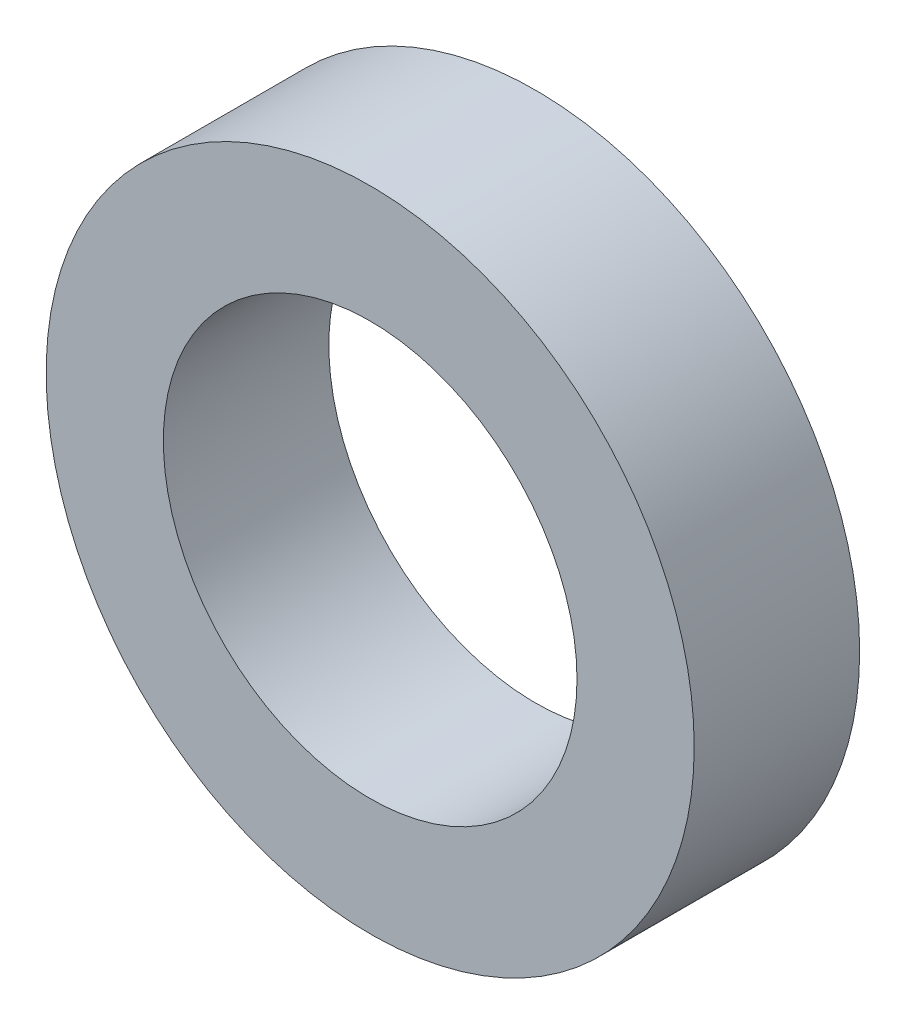
ISO-10303-21;
HEADER;
FILE_DESCRIPTION(('STEP AP214'),'2;1');
FILE_NAME('part.step','',(''),(''),'','','');
FILE_SCHEMA(('AUTOMOTIVE_DESIGN { 1 0 10303 214 1 1 1 1 }'));
ENDSEC;
DATA;
#1=APPLICATION_CONTEXT('core data for automotive mechanical design processes');
#2=APPLICATION_PROTOCOL_DEFINITION('international standard','automotive_design',2000,#1);
#3=PRODUCT_CONTEXT('',#1,'mechanical');
#4=PRODUCT('Part','Part','',(#3));
#5=PRODUCT_RELATED_PRODUCT_CATEGORY('part','',(#4));
#6=PRODUCT_DEFINITION_FORMATION('','',#4);
#7=PRODUCT_DEFINITION_CONTEXT('part definition',#1,'design');
#8=PRODUCT_DEFINITION('design','',#6,#7);
#9=PRODUCT_DEFINITION_SHAPE('','',#8);
#10=(LENGTH_UNIT() NAMED_UNIT(*) SI_UNIT(.MILLI.,.METRE.));
#11=(NAMED_UNIT(*) PLANE_ANGLE_UNIT() SI_UNIT($,.RADIAN.));
#12=(NAMED_UNIT(*) SI_UNIT($,.STERADIAN.) SOLID_ANGLE_UNIT());
#13=UNCERTAINTY_MEASURE_WITH_UNIT(LENGTH_MEASURE(1.E-05),#10,'distance_accuracy_value','');
#14=(GEOMETRIC_REPRESENTATION_CONTEXT(3) GLOBAL_UNCERTAINTY_ASSIGNED_CONTEXT((#13)) GLOBAL_UNIT_ASSIGNED_CONTEXT((#10,
#11,#12)) REPRESENTATION_CONTEXT('',''));
#15=CARTESIAN_POINT('',(0.,0.,0.));
#16=DIRECTION('',(0.,0.,1.));
#17=DIRECTION('',(1.,0.,0.));
#18=AXIS2_PLACEMENT_3D('',#15,#16,#17);
#19=CARTESIAN_POINT('',(0.,0.,12.));
#20=DIRECTION('',(0.,0.,1.));
#21=DIRECTION('',(1.,0.,0.));
#22=AXIS2_PLACEMENT_3D('',#19,#20,#21);
#23=PLANE('',#22);
#24=CARTESIAN_POINT('',(0.,0.,12.));
#25=DIRECTION('',(0.,0.,1.));
#26=DIRECTION('',(1.,0.,0.));
#27=AXIS2_PLACEMENT_3D('',#24,#25,#26);
#28=CIRCLE('',#27,23.5);
#29=CARTESIAN_POINT('',(23.5,0.,12.));
#30=VERTEX_POINT('',#29);
#31=EDGE_CURVE('E10',#30,#30,#28,.T.);
#32=ORIENTED_EDGE('',*,*,#31,.T.);
#33=EDGE_LOOP('',(#32));
#34=FACE_BOUND('',#33,.T.);
#35=CARTESIAN_POINT('',(0.,0.,12.));
#36=DIRECTION('',(0.,0.,1.));
#37=DIRECTION('',(1.,0.,0.));
#38=AXIS2_PLACEMENT_3D('',#35,#36,#37);
#39=CIRCLE('',#38,15.);
#40=CARTESIAN_POINT('',(15.,0.,12.));
#41=VERTEX_POINT('',#40);
#42=EDGE_CURVE('E43',#41,#41,#39,.T.);
#43=ORIENTED_EDGE('',*,*,#42,.F.);
#44=EDGE_LOOP('',(#43));
#45=FACE_BOUND('',#44,.T.);
#46=ADVANCED_FACE('F32',(#34,#45),#23,.T.);
#47=CARTESIAN_POINT('',(0.,0.,0.));
#48=DIRECTION('',(0.,0.,1.));
#49=DIRECTION('',(1.,0.,0.));
#50=AXIS2_PLACEMENT_3D('',#47,#48,#49);
#51=PLANE('',#50);
#52=CARTESIAN_POINT('',(0.,0.,0.));
#53=DIRECTION('',(0.,0.,1.));
#54=DIRECTION('',(1.,0.,0.));
#55=AXIS2_PLACEMENT_3D('',#52,#53,#54);
#56=CIRCLE('',#55,23.5);
#57=CARTESIAN_POINT('',(23.5,0.,0.));
#58=VERTEX_POINT('',#57);
#59=EDGE_CURVE('E36',#58,#58,#56,.T.);
#60=ORIENTED_EDGE('',*,*,#59,.F.);
#61=EDGE_LOOP('',(#60));
#62=FACE_BOUND('',#61,.T.);
#63=CARTESIAN_POINT('',(0.,0.,0.));
#64=DIRECTION('',(0.,0.,1.));
#65=DIRECTION('',(1.,0.,0.));
#66=AXIS2_PLACEMENT_3D('',#63,#64,#65);
#67=CIRCLE('',#66,15.);
#68=CARTESIAN_POINT('',(15.,0.,0.));
#69=VERTEX_POINT('',#68);
#70=EDGE_CURVE('E45',#69,#69,#67,.T.);
#71=ORIENTED_EDGE('',*,*,#70,.T.);
#72=EDGE_LOOP('',(#71));
#73=FACE_BOUND('',#72,.T.);
#74=ADVANCED_FACE('F55',(#62,#73),#51,.F.);
#75=CARTESIAN_POINT('',(0.,0.,12.));
#76=DIRECTION('',(0.,0.,-1.));
#77=DIRECTION('',(-1.,0.,0.));
#78=AXIS2_PLACEMENT_3D('',#75,#76,#77);
#79=CYLINDRICAL_SURFACE('',#78,23.5);
#80=ORIENTED_EDGE('',*,*,#31,.F.);
#81=EDGE_LOOP('',(#80));
#82=FACE_BOUND('',#81,.T.);
#83=ORIENTED_EDGE('',*,*,#59,.T.);
#84=EDGE_LOOP('',(#83));
#85=FACE_BOUND('',#84,.T.);
#86=ADVANCED_FACE('F34',(#82,#85),#79,.T.);
#87=CARTESIAN_POINT('',(0.,0.,12.));
#88=DIRECTION('',(0.,0.,-1.));
#89=DIRECTION('',(-1.,0.,0.));
#90=AXIS2_PLACEMENT_3D('',#87,#88,#89);
#91=CYLINDRICAL_SURFACE('',#90,15.);
#92=ORIENTED_EDGE('',*,*,#42,.T.);
#93=EDGE_LOOP('',(#92));
#94=FACE_BOUND('',#93,.T.);
#95=ORIENTED_EDGE('',*,*,#70,.F.);
#96=EDGE_LOOP('',(#95));
#97=FACE_BOUND('',#96,.T.);
#98=ADVANCED_FACE('F51',(#94,#97),#91,.F.);
#99=CLOSED_SHELL('',(#46,#74,#86,#98));
#100=MANIFOLD_SOLID_BREP('B2',#99);
#101=ADVANCED_BREP_SHAPE_REPRESENTATION('',(#18,#100),#14);
#102=SHAPE_DEFINITION_REPRESENTATION(#9,#101);
ENDSEC;
END-ISO-10303-21;
